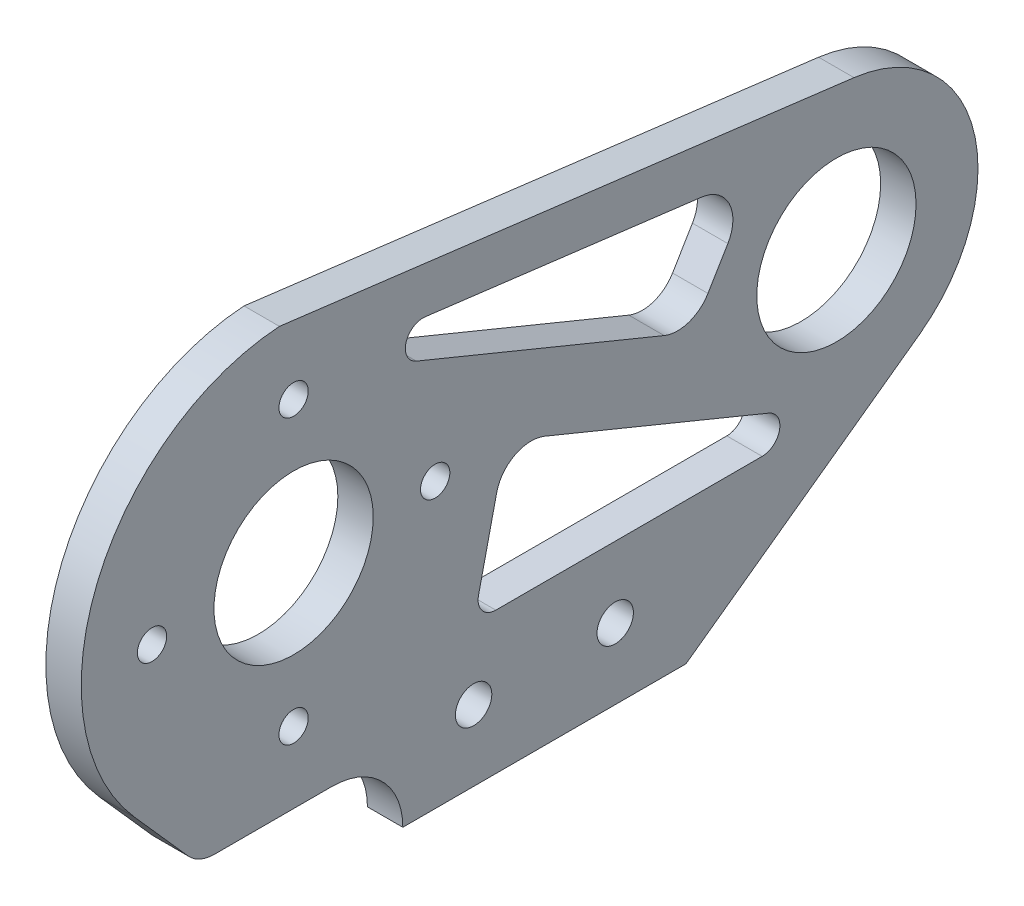
ISO-10303-21;
HEADER;
FILE_DESCRIPTION(('STEP AP214'),'2;1');
FILE_NAME('part.step','',(''),(''),'','','');
FILE_SCHEMA(('AUTOMOTIVE_DESIGN { 1 0 10303 214 1 1 1 1 }'));
ENDSEC;
DATA;
#1=APPLICATION_CONTEXT('core data for automotive mechanical design processes');
#2=APPLICATION_PROTOCOL_DEFINITION('international standard','automotive_design',2000,#1);
#3=PRODUCT_CONTEXT('',#1,'mechanical');
#4=PRODUCT('Part','Part','',(#3));
#5=PRODUCT_RELATED_PRODUCT_CATEGORY('part','',(#4));
#6=PRODUCT_DEFINITION_FORMATION('','',#4);
#7=PRODUCT_DEFINITION_CONTEXT('part definition',#1,'design');
#8=PRODUCT_DEFINITION('design','',#6,#7);
#9=PRODUCT_DEFINITION_SHAPE('','',#8);
#10=(LENGTH_UNIT() NAMED_UNIT(*) SI_UNIT(.MILLI.,.METRE.));
#11=(NAMED_UNIT(*) PLANE_ANGLE_UNIT() SI_UNIT($,.RADIAN.));
#12=(NAMED_UNIT(*) SI_UNIT($,.STERADIAN.) SOLID_ANGLE_UNIT());
#13=UNCERTAINTY_MEASURE_WITH_UNIT(LENGTH_MEASURE(1.E-05),#10,'distance_accuracy_value','');
#14=(GEOMETRIC_REPRESENTATION_CONTEXT(3) GLOBAL_UNCERTAINTY_ASSIGNED_CONTEXT((#13)) GLOBAL_UNIT_ASSIGNED_CONTEXT((#10,
#11,#12)) REPRESENTATION_CONTEXT('',''));
#15=CARTESIAN_POINT('',(0.,0.,0.));
#16=DIRECTION('',(0.,0.,1.));
#17=DIRECTION('',(1.,0.,0.));
#18=AXIS2_PLACEMENT_3D('',#15,#16,#17);
#19=CARTESIAN_POINT('',(6.35,50.8851232861347,-5.80393720326229));
#20=DIRECTION('',(1.,0.,0.));
#21=DIRECTION('',(0.,0.,-1.));
#22=AXIS2_PLACEMENT_3D('',#19,#20,#21);
#23=PLANE('',#22);
#24=DIRECTION('',(0.,0.379904230506979,0.925025824311354));
#25=VECTOR('',#24,1.);
#26=CARTESIAN_POINT('',(6.35,50.8851232861347,-77.3334148983434));
#27=LINE('',#26,#25);
#28=CARTESIAN_POINT('',(6.35,52.9606160409903,-72.2798139056655));
#29=VERTEX_POINT('',#28);
#30=CARTESIAN_POINT('',(6.35,71.2199879210552,-27.8202128577265));
#31=VERTEX_POINT('',#30);
#32=EDGE_CURVE('E464',#29,#31,#27,.T.);
#33=ORIENTED_EDGE('',*,*,#32,.T.);
#34=CARTESIAN_POINT('',(6.35,74.1569449132437,-29.0264087895862));
#35=DIRECTION('',(1.,0.,0.));
#36=DIRECTION('',(0.,0.,-1.));
#37=AXIS2_PLACEMENT_3D('',#34,#35,#36);
#38=CIRCLE('',#37,3.175);
#39=CARTESIAN_POINT('',(6.35,77.3073858178269,-29.4205497627529));
#40=VERTEX_POINT('',#39);
#41=EDGE_CURVE('E319',#31,#40,#38,.F.);
#42=ORIENTED_EDGE('',*,*,#41,.T.);
#43=DIRECTION('',(0.,-0.124138889186376,-0.992264851837236));
#44=VECTOR('',#43,1.);
#45=CARTESIAN_POINT('',(6.35,80.261980091777,-5.80393720326229));
#46=LINE('',#45,#44);
#47=CARTESIAN_POINT('',(6.35,71.0982703150576,-79.0511459020964));
#48=VERTEX_POINT('',#47);
#49=EDGE_CURVE('E748',#40,#48,#46,.T.);
#50=ORIENTED_EDGE('',*,*,#49,.T.);
#51=CARTESIAN_POINT('',(6.35,64.7973885058911,-78.2628639557629));
#52=DIRECTION('',(1.,0.,0.));
#53=DIRECTION('',(0.,0.,-1.));
#54=AXIS2_PLACEMENT_3D('',#51,#52,#53);
#55=CIRCLE('',#54,6.35);
#56=CARTESIAN_POINT('',(6.35,61.5350824967538,-83.710786449957));
#57=VERTEX_POINT('',#56);
#58=EDGE_CURVE('E310',#48,#57,#55,.F.);
#59=ORIENTED_EDGE('',*,*,#58,.T.);
#60=DIRECTION('',(0.,-0.857940550266799,0.513748977816893));
#61=VECTOR('',#60,1.);
#62=CARTESIAN_POINT('',(6.35,69.8894439562592,-88.7135161365292));
#63=LINE('',#62,#61);
#64=CARTESIAN_POINT('',(6.35,55.5722240162302,-80.140128263579));
#65=VERTEX_POINT('',#64);
#66=EDGE_CURVE('E743',#57,#65,#63,.T.);
#67=ORIENTED_EDGE('',*,*,#66,.T.);
#68=CARTESIAN_POINT('',(6.35,58.8345300253674,-74.6922057693848));
#69=DIRECTION('',(1.,0.,0.));
#70=DIRECTION('',(0.,0.,-1.));
#71=AXIS2_PLACEMENT_3D('',#68,#69,#70);
#72=CIRCLE('',#71,6.35);
#73=EDGE_CURVE('E299',#65,#29,#72,.F.);
#74=ORIENTED_EDGE('',*,*,#73,.T.);
#75=EDGE_LOOP('',(#33,#42,#50,#59,#67,#74));
#76=FACE_BOUND('',#75,.T.);
#77=DIRECTION('',(0.,-0.379904230506979,-0.925025824311354));
#78=VECTOR('',#77,1.);
#79=CARTESIAN_POINT('',(6.35,25.4,-105.957463545871));
#80=LINE('',#79,#78);
#81=CARTESIAN_POINT('',(6.35,48.0355854751354,-50.8422544181257));
#82=VERTEX_POINT('',#81);
#83=CARTESIAN_POINT('',(6.35,31.5119569921885,-91.0755075136625));
#84=VERTEX_POINT('',#83);
#85=EDGE_CURVE('E444',#82,#84,#80,.T.);
#86=ORIENTED_EDGE('',*,*,#85,.T.);
#87=CARTESIAN_POINT('',(6.35,28.575,-89.8693115818029));
#88=DIRECTION('',(1.,0.,0.));
#89=DIRECTION('',(0.,0.,-1.));
#90=AXIS2_PLACEMENT_3D('',#87,#88,#89);
#91=CIRCLE('',#90,3.175);
#92=CARTESIAN_POINT('',(6.35,25.4,-89.8693115818029));
#93=VERTEX_POINT('',#92);
#94=EDGE_CURVE('E350',#84,#93,#91,.F.);
#95=ORIENTED_EDGE('',*,*,#94,.T.);
#96=DIRECTION('',(0.,0.,1.));
#97=VECTOR('',#96,1.);
#98=CARTESIAN_POINT('',(6.35,25.4,-38.1));
#99=LINE('',#98,#97);
#100=CARTESIAN_POINT('',(6.35,25.4,-42.0793633905013));
#101=VERTEX_POINT('',#100);
#102=EDGE_CURVE('E442',#93,#101,#99,.T.);
#103=ORIENTED_EDGE('',*,*,#102,.T.);
#104=CARTESIAN_POINT('',(6.35,28.575,-42.0793633905013));
#105=DIRECTION('',(1.,0.,0.));
#106=DIRECTION('',(0.,0.,-1.));
#107=AXIS2_PLACEMENT_3D('',#104,#105,#106);
#108=CIRCLE('',#107,3.175);
#109=CARTESIAN_POINT('',(6.35,29.280017267135,-38.9836283157507));
#110=VERTEX_POINT('',#109);
#111=EDGE_CURVE('E341',#101,#110,#108,.F.);
#112=ORIENTED_EDGE('',*,*,#111,.T.);
#113=DIRECTION('',(0.,0.975034669212807,-0.222052682562207));
#114=VECTOR('',#113,1.);
#115=CARTESIAN_POINT('',(6.35,50.8851232861347,-43.9039372032623));
#116=LINE('',#115,#114);
#117=CARTESIAN_POINT('',(6.35,43.5717060250283,-42.238392404905));
#118=VERTEX_POINT('',#117);
#119=EDGE_CURVE('E450',#110,#118,#116,.T.);
#120=ORIENTED_EDGE('',*,*,#119,.T.);
#121=CARTESIAN_POINT('',(6.35,42.1616714907583,-48.4298625544063));
#122=DIRECTION('',(1.,0.,0.));
#123=DIRECTION('',(0.,0.,-1.));
#124=AXIS2_PLACEMENT_3D('',#121,#122,#123);
#125=CIRCLE('',#124,6.35);
#126=EDGE_CURVE('E330',#118,#82,#125,.F.);
#127=ORIENTED_EDGE('',*,*,#126,.T.);
#128=EDGE_LOOP('',(#86,#95,#103,#112,#120,#127));
#129=FACE_BOUND('',#128,.T.);
#130=DIRECTION('',(0.,-0.748266379436419,-0.66339839116862));
#131=VECTOR('',#130,1.);
#132=CARTESIAN_POINT('',(6.35,0.,0.));
#133=LINE('',#132,#131);
#134=CARTESIAN_POINT('',(6.35,25.6096445826102,22.7050118532653));
#135=VERTEX_POINT('',#134);
#136=CARTESIAN_POINT('',(6.35,14.8374202160793,13.1545676392054));
#137=VERTEX_POINT('',#136);
#138=EDGE_CURVE('E199',#135,#137,#133,.T.);
#139=ORIENTED_EDGE('',*,*,#138,.T.);
#140=CARTESIAN_POINT('',(6.35,19.05,8.40307612978418));
#141=DIRECTION('',(1.,0.,0.));
#142=DIRECTION('',(0.,0.,-1.));
#143=AXIS2_PLACEMENT_3D('',#140,#141,#142);
#144=CIRCLE('',#143,6.35);
#145=CARTESIAN_POINT('',(6.35,12.7,8.40307612978418));
#146=VERTEX_POINT('',#145);
#147=EDGE_CURVE('E60',#137,#146,#144,.T.);
#148=ORIENTED_EDGE('',*,*,#147,.T.);
#149=DIRECTION('',(0.,0.,-1.));
#150=VECTOR('',#149,1.);
#151=CARTESIAN_POINT('',(6.35,12.7,0.));
#152=LINE('',#151,#150);
#153=CARTESIAN_POINT('',(6.35,12.7,-12.7));
#154=VERTEX_POINT('',#153);
#155=EDGE_CURVE('E182',#146,#154,#152,.T.);
#156=ORIENTED_EDGE('',*,*,#155,.T.);
#157=CARTESIAN_POINT('',(6.35,0.,-12.7));
#158=DIRECTION('',(1.,0.,0.));
#159=DIRECTION('',(0.,0.,-1.));
#160=AXIS2_PLACEMENT_3D('',#157,#158,#159);
#161=CIRCLE('',#160,12.7);
#162=CARTESIAN_POINT('',(6.35,0.,-25.4));
#163=VERTEX_POINT('',#162);
#164=EDGE_CURVE('E177',#154,#163,#161,.F.);
#165=ORIENTED_EDGE('',*,*,#164,.T.);
#166=DIRECTION('',(0.,0.,-1.));
#167=VECTOR('',#166,1.);
#168=CARTESIAN_POINT('',(6.35,0.,0.));
#169=LINE('',#168,#167);
#170=CARTESIAN_POINT('',(6.35,0.,-76.2));
#171=VERTEX_POINT('',#170);
#172=EDGE_CURVE('E180',#163,#171,#169,.T.);
#173=ORIENTED_EDGE('',*,*,#172,.T.);
#174=DIRECTION('',(0.,0.585201192116197,-0.81088813331173));
#175=VECTOR('',#174,1.);
#176=CARTESIAN_POINT('',(6.35,0.,-76.2));
#177=LINE('',#176,#175);
#178=CARTESIAN_POINT('',(6.35,30.2034414138821,-118.051610279751));
#179=VERTEX_POINT('',#178);
#180=EDGE_CURVE('E198',#171,#179,#177,.T.);
#181=ORIENTED_EDGE('',*,*,#180,.T.);
#182=CARTESIAN_POINT('',(6.35,50.8,-103.1875));
#183=DIRECTION('',(1.,0.,0.));
#184=DIRECTION('',(0.,0.,-1.));
#185=AXIS2_PLACEMENT_3D('',#182,#183,#184);
#186=CIRCLE('',#185,25.4);
#187=CARTESIAN_POINT('',(6.35,76.0035272366658,-106.340627785334));
#188=VERTEX_POINT('',#187);
#189=EDGE_CURVE('E260',#179,#188,#186,.T.);
#190=ORIENTED_EDGE('',*,*,#189,.T.);
#191=DIRECTION('',(0.,0.124138889186376,0.992264851837236));
#192=VECTOR('',#191,1.);
#193=CARTESIAN_POINT('',(6.35,76.0035272366658,-106.340627785334));
#194=LINE('',#193,#192);
#195=CARTESIAN_POINT('',(6.35,88.8999232951525,-3.25737476059984));
#196=VERTEX_POINT('',#195);
#197=EDGE_CURVE('E262',#188,#196,#194,.T.);
#198=ORIENTED_EDGE('',*,*,#197,.T.);
#199=CARTESIAN_POINT('',(6.35,50.8851232861347,-5.80393720326229));
#200=DIRECTION('',(1.,0.,0.));
#201=DIRECTION('',(0.,0.,-1.));
#202=AXIS2_PLACEMENT_3D('',#199,#200,#201);
#203=CIRCLE('',#202,38.1);
#204=EDGE_CURVE('E264',#196,#135,#203,.T.);
#205=ORIENTED_EDGE('',*,*,#204,.T.);
#206=EDGE_LOOP('',(#139,#148,#156,#165,#173,#181,#190,#198,#205));
#207=FACE_BOUND('',#206,.T.);
#208=CARTESIAN_POINT('',(6.35,50.8851232861347,-31.2039372032623));
#209=DIRECTION('',(1.,0.,0.));
#210=DIRECTION('',(0.,0.,-1.));
#211=AXIS2_PLACEMENT_3D('',#208,#209,#210);
#212=CIRCLE('',#211,2.62890000000002);
#213=CARTESIAN_POINT('',(6.35,50.8851232861347,-33.8328372032623));
#214=VERTEX_POINT('',#213);
#215=EDGE_CURVE('E215',#214,#214,#212,.T.);
#216=ORIENTED_EDGE('',*,*,#215,.F.);
#217=EDGE_LOOP('',(#216));
#218=FACE_BOUND('',#217,.T.);
#219=CARTESIAN_POINT('',(6.35,76.2851232861346,-5.80393720326229));
#220=DIRECTION('',(1.,0.,0.));
#221=DIRECTION('',(0.,0.,-1.));
#222=AXIS2_PLACEMENT_3D('',#219,#220,#221);
#223=CIRCLE('',#222,2.62890000000003);
#224=CARTESIAN_POINT('',(6.35,76.2851232861346,-8.43283720326233));
#225=VERTEX_POINT('',#224);
#226=EDGE_CURVE('E227',#225,#225,#223,.T.);
#227=ORIENTED_EDGE('',*,*,#226,.F.);
#228=EDGE_LOOP('',(#227));
#229=FACE_BOUND('',#228,.T.);
#230=CARTESIAN_POINT('',(6.35,12.7,-63.5));
#231=DIRECTION('',(1.,0.,0.));
#232=DIRECTION('',(0.,0.,-1.));
#233=AXIS2_PLACEMENT_3D('',#230,#231,#232);
#234=CIRCLE('',#233,3.26390000000002);
#235=CARTESIAN_POINT('',(6.35,12.7,-66.7639));
#236=VERTEX_POINT('',#235);
#237=EDGE_CURVE('E239',#236,#236,#234,.T.);
#238=ORIENTED_EDGE('',*,*,#237,.F.);
#239=EDGE_LOOP('',(#238));
#240=FACE_BOUND('',#239,.T.);
#241=CARTESIAN_POINT('',(6.35,50.8851232861347,-5.80393720326229));
#242=DIRECTION('',(1.,0.,0.));
#243=DIRECTION('',(0.,0.,-1.));
#244=AXIS2_PLACEMENT_3D('',#241,#242,#243);
#245=CIRCLE('',#244,14.2875);
#246=CARTESIAN_POINT('',(6.35,50.8851232861347,-20.0914372032623));
#247=VERTEX_POINT('',#246);
#248=EDGE_CURVE('E251',#247,#247,#245,.T.);
#249=ORIENTED_EDGE('',*,*,#248,.F.);
#250=EDGE_LOOP('',(#249));
#251=FACE_BOUND('',#250,.T.);
#252=CARTESIAN_POINT('',(6.35,12.7,-38.1));
#253=DIRECTION('',(1.,0.,0.));
#254=DIRECTION('',(0.,0.,-1.));
#255=AXIS2_PLACEMENT_3D('',#252,#253,#254);
#256=CIRCLE('',#255,3.26390000000003);
#257=CARTESIAN_POINT('',(6.35,12.7,-41.3639));
#258=VERTEX_POINT('',#257);
#259=EDGE_CURVE('E245',#258,#258,#256,.T.);
#260=ORIENTED_EDGE('',*,*,#259,.F.);
#261=EDGE_LOOP('',(#260));
#262=FACE_BOUND('',#261,.T.);
#263=CARTESIAN_POINT('',(6.35,50.8,-103.1875));
#264=DIRECTION('',(1.,0.,0.));
#265=DIRECTION('',(0.,0.,-1.));
#266=AXIS2_PLACEMENT_3D('',#263,#264,#265);
#267=CIRCLE('',#266,14.2875);
#268=CARTESIAN_POINT('',(6.35,50.8,-117.475));
#269=VERTEX_POINT('',#268);
#270=EDGE_CURVE('E233',#269,#269,#267,.T.);
#271=ORIENTED_EDGE('',*,*,#270,.F.);
#272=EDGE_LOOP('',(#271));
#273=FACE_BOUND('',#272,.T.);
#274=CARTESIAN_POINT('',(6.35,25.4851232861347,-5.8039372032623));
#275=DIRECTION('',(1.,0.,0.));
#276=DIRECTION('',(0.,0.,-1.));
#277=AXIS2_PLACEMENT_3D('',#274,#275,#276);
#278=CIRCLE('',#277,2.62890000000002);
#279=CARTESIAN_POINT('',(6.35,25.4851232861347,-8.43283720326232));
#280=VERTEX_POINT('',#279);
#281=EDGE_CURVE('E221',#280,#280,#278,.T.);
#282=ORIENTED_EDGE('',*,*,#281,.F.);
#283=EDGE_LOOP('',(#282));
#284=FACE_BOUND('',#283,.T.);
#285=CARTESIAN_POINT('',(6.35,50.8851232861347,19.5960627967377));
#286=DIRECTION('',(1.,0.,0.));
#287=DIRECTION('',(0.,0.,-1.));
#288=AXIS2_PLACEMENT_3D('',#285,#286,#287);
#289=CIRCLE('',#288,2.62890000000003);
#290=CARTESIAN_POINT('',(6.35,50.8851232861347,16.9671627967377));
#291=VERTEX_POINT('',#290);
#292=EDGE_CURVE('E206',#291,#291,#289,.T.);
#293=ORIENTED_EDGE('',*,*,#292,.F.);
#294=EDGE_LOOP('',(#293));
#295=FACE_BOUND('',#294,.T.);
#296=ADVANCED_FACE('F38',(#76,#129,#207,#218,#229,#240,#251,#262,#273,#284,#295),#23,.T.);
#297=CARTESIAN_POINT('',(0.,50.8851232861347,-5.80393720326229));
#298=DIRECTION('',(1.,0.,0.));
#299=DIRECTION('',(0.,0.,-1.));
#300=AXIS2_PLACEMENT_3D('',#297,#298,#299);
#301=PLANE('',#300);
#302=DIRECTION('',(0.,-0.857940550266799,0.513748977816893));
#303=VECTOR('',#302,1.);
#304=CARTESIAN_POINT('',(0.,69.8894439562592,-88.7135161365292));
#305=LINE('',#304,#303);
#306=CARTESIAN_POINT('',(0.,61.5350824967538,-83.710786449957));
#307=VERTEX_POINT('',#306);
#308=CARTESIAN_POINT('',(0.,55.5722240162302,-80.140128263579));
#309=VERTEX_POINT('',#308);
#310=EDGE_CURVE('E754',#307,#309,#305,.T.);
#311=ORIENTED_EDGE('',*,*,#310,.F.);
#312=CARTESIAN_POINT('',(0.,64.7973885058911,-78.2628639557629));
#313=DIRECTION('',(1.,0.,0.));
#314=DIRECTION('',(0.,0.,-1.));
#315=AXIS2_PLACEMENT_3D('',#312,#313,#314);
#316=CIRCLE('',#315,6.35);
#317=CARTESIAN_POINT('',(0.,71.0982703150576,-79.0511459020964));
#318=VERTEX_POINT('',#317);
#319=EDGE_CURVE('E307',#307,#318,#316,.T.);
#320=ORIENTED_EDGE('',*,*,#319,.T.);
#321=DIRECTION('',(0.,-0.124138889186376,-0.992264851837236));
#322=VECTOR('',#321,1.);
#323=CARTESIAN_POINT('',(0.,80.261980091777,-5.80393720326229));
#324=LINE('',#323,#322);
#325=CARTESIAN_POINT('',(0.,77.3073858178269,-29.4205497627529));
#326=VERTEX_POINT('',#325);
#327=EDGE_CURVE('E753',#326,#318,#324,.T.);
#328=ORIENTED_EDGE('',*,*,#327,.F.);
#329=CARTESIAN_POINT('',(0.,74.1569449132437,-29.0264087895862));
#330=DIRECTION('',(1.,0.,0.));
#331=DIRECTION('',(0.,0.,-1.));
#332=AXIS2_PLACEMENT_3D('',#329,#330,#331);
#333=CIRCLE('',#332,3.175);
#334=CARTESIAN_POINT('',(0.,71.2199879210552,-27.8202128577265));
#335=VERTEX_POINT('',#334);
#336=EDGE_CURVE('E317',#326,#335,#333,.T.);
#337=ORIENTED_EDGE('',*,*,#336,.T.);
#338=DIRECTION('',(0.,0.379904230506979,0.925025824311354));
#339=VECTOR('',#338,1.);
#340=CARTESIAN_POINT('',(0.,50.8851232861347,-77.3334148983434));
#341=LINE('',#340,#339);
#342=CARTESIAN_POINT('',(0.,52.9606160409903,-72.2798139056655));
#343=VERTEX_POINT('',#342);
#344=EDGE_CURVE('E458',#343,#335,#341,.T.);
#345=ORIENTED_EDGE('',*,*,#344,.F.);
#346=CARTESIAN_POINT('',(0.,58.8345300253674,-74.6922057693848));
#347=DIRECTION('',(1.,0.,0.));
#348=DIRECTION('',(0.,0.,-1.));
#349=AXIS2_PLACEMENT_3D('',#346,#347,#348);
#350=CIRCLE('',#349,6.35);
#351=EDGE_CURVE('E296',#343,#309,#350,.T.);
#352=ORIENTED_EDGE('',*,*,#351,.T.);
#353=EDGE_LOOP('',(#311,#320,#328,#337,#345,#352));
#354=FACE_BOUND('',#353,.T.);
#355=DIRECTION('',(0.,0.975034669212807,-0.222052682562207));
#356=VECTOR('',#355,1.);
#357=CARTESIAN_POINT('',(0.,50.8851232861347,-43.9039372032623));
#358=LINE('',#357,#356);
#359=CARTESIAN_POINT('',(0.,29.280017267135,-38.9836283157507));
#360=VERTEX_POINT('',#359);
#361=CARTESIAN_POINT('',(0.,43.5717060250283,-42.238392404905));
#362=VERTEX_POINT('',#361);
#363=EDGE_CURVE('E455',#360,#362,#358,.T.);
#364=ORIENTED_EDGE('',*,*,#363,.F.);
#365=CARTESIAN_POINT('',(0.,28.575,-42.0793633905013));
#366=DIRECTION('',(1.,0.,0.));
#367=DIRECTION('',(0.,0.,-1.));
#368=AXIS2_PLACEMENT_3D('',#365,#366,#367);
#369=CIRCLE('',#368,3.175);
#370=CARTESIAN_POINT('',(0.,25.4,-42.0793633905013));
#371=VERTEX_POINT('',#370);
#372=EDGE_CURVE('E338',#360,#371,#369,.T.);
#373=ORIENTED_EDGE('',*,*,#372,.T.);
#374=DIRECTION('',(0.,0.,1.));
#375=VECTOR('',#374,1.);
#376=CARTESIAN_POINT('',(0.,25.4,-38.1));
#377=LINE('',#376,#375);
#378=CARTESIAN_POINT('',(0.,25.4,-89.8693115818029));
#379=VERTEX_POINT('',#378);
#380=EDGE_CURVE('E462',#379,#371,#377,.T.);
#381=ORIENTED_EDGE('',*,*,#380,.F.);
#382=CARTESIAN_POINT('',(0.,28.575,-89.8693115818029));
#383=DIRECTION('',(1.,0.,0.));
#384=DIRECTION('',(0.,0.,-1.));
#385=AXIS2_PLACEMENT_3D('',#382,#383,#384);
#386=CIRCLE('',#385,3.175);
#387=CARTESIAN_POINT('',(0.,31.5119569921885,-91.0755075136625));
#388=VERTEX_POINT('',#387);
#389=EDGE_CURVE('E348',#379,#388,#386,.T.);
#390=ORIENTED_EDGE('',*,*,#389,.T.);
#391=DIRECTION('',(0.,-0.379904230506979,-0.925025824311354));
#392=VECTOR('',#391,1.);
#393=CARTESIAN_POINT('',(0.,25.4,-105.957463545871));
#394=LINE('',#393,#392);
#395=CARTESIAN_POINT('',(0.,48.0355854751354,-50.8422544181257));
#396=VERTEX_POINT('',#395);
#397=EDGE_CURVE('E451',#396,#388,#394,.T.);
#398=ORIENTED_EDGE('',*,*,#397,.F.);
#399=CARTESIAN_POINT('',(0.,42.1616714907583,-48.4298625544063));
#400=DIRECTION('',(1.,0.,0.));
#401=DIRECTION('',(0.,0.,-1.));
#402=AXIS2_PLACEMENT_3D('',#399,#400,#401);
#403=CIRCLE('',#402,6.35);
#404=EDGE_CURVE('E327',#396,#362,#403,.T.);
#405=ORIENTED_EDGE('',*,*,#404,.T.);
#406=EDGE_LOOP('',(#364,#373,#381,#390,#398,#405));
#407=FACE_BOUND('',#406,.T.);
#408=DIRECTION('',(0.,0.,-1.));
#409=VECTOR('',#408,1.);
#410=CARTESIAN_POINT('',(0.,12.7,0.));
#411=LINE('',#410,#409);
#412=CARTESIAN_POINT('',(0.,12.7,8.40307612978418));
#413=VERTEX_POINT('',#412);
#414=CARTESIAN_POINT('',(0.,12.7,-12.7));
#415=VERTEX_POINT('',#414);
#416=EDGE_CURVE('E208',#413,#415,#411,.T.);
#417=ORIENTED_EDGE('',*,*,#416,.F.);
#418=CARTESIAN_POINT('',(0.,19.05,8.40307612978418));
#419=DIRECTION('',(1.,0.,0.));
#420=DIRECTION('',(0.,0.,-1.));
#421=AXIS2_PLACEMENT_3D('',#418,#419,#420);
#422=CIRCLE('',#421,6.35);
#423=CARTESIAN_POINT('',(0.,14.8374202160793,13.1545676392054));
#424=VERTEX_POINT('',#423);
#425=EDGE_CURVE('E11',#413,#424,#422,.F.);
#426=ORIENTED_EDGE('',*,*,#425,.T.);
#427=DIRECTION('',(0.,-0.748266379436419,-0.66339839116862));
#428=VECTOR('',#427,1.);
#429=CARTESIAN_POINT('',(0.,0.,0.));
#430=LINE('',#429,#428);
#431=CARTESIAN_POINT('',(0.,25.6096445826102,22.7050118532653));
#432=VERTEX_POINT('',#431);
#433=EDGE_CURVE('E254',#432,#424,#430,.T.);
#434=ORIENTED_EDGE('',*,*,#433,.F.);
#435=CARTESIAN_POINT('',(0.,50.8851232861347,-5.80393720326229));
#436=DIRECTION('',(1.,0.,0.));
#437=DIRECTION('',(0.,0.,-1.));
#438=AXIS2_PLACEMENT_3D('',#435,#436,#437);
#439=CIRCLE('',#438,38.1);
#440=CARTESIAN_POINT('',(0.,88.8999232951525,-3.25737476059984));
#441=VERTEX_POINT('',#440);
#442=EDGE_CURVE('E257',#441,#432,#439,.T.);
#443=ORIENTED_EDGE('',*,*,#442,.F.);
#444=DIRECTION('',(0.,0.124138889186376,0.992264851837236));
#445=VECTOR('',#444,1.);
#446=CARTESIAN_POINT('',(0.,76.0035272366658,-106.340627785334));
#447=LINE('',#446,#445);
#448=CARTESIAN_POINT('',(0.,76.0035272366658,-106.340627785334));
#449=VERTEX_POINT('',#448);
#450=EDGE_CURVE('E275',#449,#441,#447,.T.);
#451=ORIENTED_EDGE('',*,*,#450,.F.);
#452=CARTESIAN_POINT('',(0.,50.8,-103.1875));
#453=DIRECTION('',(1.,0.,0.));
#454=DIRECTION('',(0.,0.,-1.));
#455=AXIS2_PLACEMENT_3D('',#452,#453,#454);
#456=CIRCLE('',#455,25.4);
#457=CARTESIAN_POINT('',(0.,30.2034414138821,-118.051610279751));
#458=VERTEX_POINT('',#457);
#459=EDGE_CURVE('E273',#458,#449,#456,.T.);
#460=ORIENTED_EDGE('',*,*,#459,.F.);
#461=DIRECTION('',(0.,0.585201192116197,-0.81088813331173));
#462=VECTOR('',#461,1.);
#463=CARTESIAN_POINT('',(0.,0.,-76.2));
#464=LINE('',#463,#462);
#465=CARTESIAN_POINT('',(0.,0.,-76.2));
#466=VERTEX_POINT('',#465);
#467=EDGE_CURVE('E271',#466,#458,#464,.T.);
#468=ORIENTED_EDGE('',*,*,#467,.F.);
#469=DIRECTION('',(0.,0.,-1.));
#470=VECTOR('',#469,1.);
#471=CARTESIAN_POINT('',(0.,0.,0.));
#472=LINE('',#471,#470);
#473=CARTESIAN_POINT('',(0.,0.,-25.4));
#474=VERTEX_POINT('',#473);
#475=EDGE_CURVE('E269',#474,#466,#472,.T.);
#476=ORIENTED_EDGE('',*,*,#475,.F.);
#477=CARTESIAN_POINT('',(0.,0.,-12.7));
#478=DIRECTION('',(1.,0.,0.));
#479=DIRECTION('',(0.,0.,-1.));
#480=AXIS2_PLACEMENT_3D('',#477,#478,#479);
#481=CIRCLE('',#480,12.7);
#482=EDGE_CURVE('E188',#474,#415,#481,.T.);
#483=ORIENTED_EDGE('',*,*,#482,.T.);
#484=EDGE_LOOP('',(#417,#426,#434,#443,#451,#460,#468,#476,#483));
#485=FACE_BOUND('',#484,.T.);
#486=CARTESIAN_POINT('',(0.,50.8851232861347,-5.80393720326229));
#487=DIRECTION('',(1.,0.,0.));
#488=DIRECTION('',(0.,0.,-1.));
#489=AXIS2_PLACEMENT_3D('',#486,#487,#488);
#490=CIRCLE('',#489,14.2875);
#491=CARTESIAN_POINT('',(0.,50.8851232861347,-20.0914372032623));
#492=VERTEX_POINT('',#491);
#493=EDGE_CURVE('E248',#492,#492,#490,.T.);
#494=ORIENTED_EDGE('',*,*,#493,.T.);
#495=EDGE_LOOP('',(#494));
#496=FACE_BOUND('',#495,.T.);
#497=CARTESIAN_POINT('',(0.,12.7,-38.1));
#498=DIRECTION('',(1.,0.,0.));
#499=DIRECTION('',(0.,0.,-1.));
#500=AXIS2_PLACEMENT_3D('',#497,#498,#499);
#501=CIRCLE('',#500,3.26390000000003);
#502=CARTESIAN_POINT('',(0.,12.7,-41.3639));
#503=VERTEX_POINT('',#502);
#504=EDGE_CURVE('E242',#503,#503,#501,.T.);
#505=ORIENTED_EDGE('',*,*,#504,.T.);
#506=EDGE_LOOP('',(#505));
#507=FACE_BOUND('',#506,.T.);
#508=CARTESIAN_POINT('',(0.,12.7,-63.5));
#509=DIRECTION('',(1.,0.,0.));
#510=DIRECTION('',(0.,0.,-1.));
#511=AXIS2_PLACEMENT_3D('',#508,#509,#510);
#512=CIRCLE('',#511,3.26390000000002);
#513=CARTESIAN_POINT('',(0.,12.7,-66.7639));
#514=VERTEX_POINT('',#513);
#515=EDGE_CURVE('E236',#514,#514,#512,.T.);
#516=ORIENTED_EDGE('',*,*,#515,.T.);
#517=EDGE_LOOP('',(#516));
#518=FACE_BOUND('',#517,.T.);
#519=CARTESIAN_POINT('',(0.,50.8,-103.1875));
#520=DIRECTION('',(1.,0.,0.));
#521=DIRECTION('',(0.,0.,-1.));
#522=AXIS2_PLACEMENT_3D('',#519,#520,#521);
#523=CIRCLE('',#522,14.2875);
#524=CARTESIAN_POINT('',(0.,50.8,-117.475));
#525=VERTEX_POINT('',#524);
#526=EDGE_CURVE('E230',#525,#525,#523,.T.);
#527=ORIENTED_EDGE('',*,*,#526,.T.);
#528=EDGE_LOOP('',(#527));
#529=FACE_BOUND('',#528,.T.);
#530=CARTESIAN_POINT('',(0.,76.2851232861346,-5.80393720326229));
#531=DIRECTION('',(1.,0.,0.));
#532=DIRECTION('',(0.,0.,-1.));
#533=AXIS2_PLACEMENT_3D('',#530,#531,#532);
#534=CIRCLE('',#533,2.62890000000003);
#535=CARTESIAN_POINT('',(0.,76.2851232861346,-8.43283720326233));
#536=VERTEX_POINT('',#535);
#537=EDGE_CURVE('E224',#536,#536,#534,.T.);
#538=ORIENTED_EDGE('',*,*,#537,.T.);
#539=EDGE_LOOP('',(#538));
#540=FACE_BOUND('',#539,.T.);
#541=CARTESIAN_POINT('',(0.,25.4851232861347,-5.8039372032623));
#542=DIRECTION('',(1.,0.,0.));
#543=DIRECTION('',(0.,0.,-1.));
#544=AXIS2_PLACEMENT_3D('',#541,#542,#543);
#545=CIRCLE('',#544,2.62890000000002);
#546=CARTESIAN_POINT('',(0.,25.4851232861347,-8.43283720326232));
#547=VERTEX_POINT('',#546);
#548=EDGE_CURVE('E218',#547,#547,#545,.T.);
#549=ORIENTED_EDGE('',*,*,#548,.T.);
#550=EDGE_LOOP('',(#549));
#551=FACE_BOUND('',#550,.T.);
#552=CARTESIAN_POINT('',(0.,50.8851232861347,-31.2039372032623));
#553=DIRECTION('',(1.,0.,0.));
#554=DIRECTION('',(0.,0.,-1.));
#555=AXIS2_PLACEMENT_3D('',#552,#553,#554);
#556=CIRCLE('',#555,2.62890000000002);
#557=CARTESIAN_POINT('',(0.,50.8851232861347,-33.8328372032623));
#558=VERTEX_POINT('',#557);
#559=EDGE_CURVE('E213',#558,#558,#556,.T.);
#560=ORIENTED_EDGE('',*,*,#559,.T.);
#561=EDGE_LOOP('',(#560));
#562=FACE_BOUND('',#561,.T.);
#563=CARTESIAN_POINT('',(0.,50.8851232861347,19.5960627967377));
#564=DIRECTION('',(1.,0.,0.));
#565=DIRECTION('',(0.,0.,-1.));
#566=AXIS2_PLACEMENT_3D('',#563,#564,#565);
#567=CIRCLE('',#566,2.62890000000003);
#568=CARTESIAN_POINT('',(0.,50.8851232861347,16.9671627967377));
#569=VERTEX_POINT('',#568);
#570=EDGE_CURVE('E203',#569,#569,#567,.T.);
#571=ORIENTED_EDGE('',*,*,#570,.T.);
#572=EDGE_LOOP('',(#571));
#573=FACE_BOUND('',#572,.T.);
#574=ADVANCED_FACE('F372',(#354,#407,#485,#496,#507,#518,#529,#540,#551,#562,#573),#301,.F.);
#575=CARTESIAN_POINT('',(6.35,0.,0.));
#576=DIRECTION('',(0.,0.66339839116862,-0.748266379436419));
#577=DIRECTION('',(0.,0.748266379436419,0.66339839116862));
#578=AXIS2_PLACEMENT_3D('',#575,#576,#577);
#579=PLANE('',#578);
#580=ORIENTED_EDGE('',*,*,#433,.T.);
#581=DIRECTION('',(1.,0.,0.));
#582=VECTOR('',#581,1.);
#583=CARTESIAN_POINT('',(6.35,14.8374202160793,13.1545676392054));
#584=LINE('',#583,#582);
#585=EDGE_CURVE('E187',#424,#137,#584,.T.);
#586=ORIENTED_EDGE('',*,*,#585,.T.);
#587=ORIENTED_EDGE('',*,*,#138,.F.);
#588=DIRECTION('',(-1.,0.,0.));
#589=VECTOR('',#588,1.);
#590=CARTESIAN_POINT('',(6.35,25.6096445826102,22.7050118532653));
#591=LINE('',#590,#589);
#592=EDGE_CURVE('E266',#135,#432,#591,.T.);
#593=ORIENTED_EDGE('',*,*,#592,.T.);
#594=EDGE_LOOP('',(#580,#586,#587,#593));
#595=FACE_BOUND('',#594,.T.);
#596=ADVANCED_FACE('F360',(#595),#579,.F.);
#597=CARTESIAN_POINT('',(6.35,0.,0.));
#598=DIRECTION('',(0.,1.,0.));
#599=DIRECTION('',(0.,0.,1.));
#600=AXIS2_PLACEMENT_3D('',#597,#598,#599);
#601=PLANE('',#600);
#602=ORIENTED_EDGE('',*,*,#172,.F.);
#603=DIRECTION('',(-1.,0.,0.));
#604=VECTOR('',#603,1.);
#605=CARTESIAN_POINT('',(6.35,0.,-25.4));
#606=LINE('',#605,#604);
#607=EDGE_CURVE('E193',#163,#474,#606,.T.);
#608=ORIENTED_EDGE('',*,*,#607,.T.);
#609=ORIENTED_EDGE('',*,*,#475,.T.);
#610=DIRECTION('',(-1.,0.,0.));
#611=VECTOR('',#610,1.);
#612=CARTESIAN_POINT('',(6.35,0.,-76.2));
#613=LINE('',#612,#611);
#614=EDGE_CURVE('E196',#171,#466,#613,.T.);
#615=ORIENTED_EDGE('',*,*,#614,.F.);
#616=EDGE_LOOP('',(#602,#608,#609,#615));
#617=FACE_BOUND('',#616,.T.);
#618=ADVANCED_FACE('F192',(#617),#601,.F.);
#619=CARTESIAN_POINT('',(6.35,0.,-76.2));
#620=DIRECTION('',(0.,0.810888133311729,0.585201192116197));
#621=DIRECTION('',(0.,-0.585201192116197,0.81088813331173));
#622=AXIS2_PLACEMENT_3D('',#619,#620,#621);
#623=PLANE('',#622);
#624=ORIENTED_EDGE('',*,*,#467,.T.);
#625=DIRECTION('',(-1.,0.,0.));
#626=VECTOR('',#625,1.);
#627=CARTESIAN_POINT('',(6.35,30.2034414138821,-118.051610279751));
#628=LINE('',#627,#626);
#629=EDGE_CURVE('E286',#179,#458,#628,.T.);
#630=ORIENTED_EDGE('',*,*,#629,.F.);
#631=ORIENTED_EDGE('',*,*,#180,.F.);
#632=ORIENTED_EDGE('',*,*,#614,.T.);
#633=EDGE_LOOP('',(#624,#630,#631,#632));
#634=FACE_BOUND('',#633,.T.);
#635=ADVANCED_FACE('F403',(#634),#623,.F.);
#636=CARTESIAN_POINT('',(6.35,50.8,-103.1875));
#637=DIRECTION('',(-1.,0.,0.));
#638=DIRECTION('',(0.,0.,1.));
#639=AXIS2_PLACEMENT_3D('',#636,#637,#638);
#640=CYLINDRICAL_SURFACE('',#639,25.4);
#641=ORIENTED_EDGE('',*,*,#459,.T.);
#642=DIRECTION('',(-1.,0.,0.));
#643=VECTOR('',#642,1.);
#644=CARTESIAN_POINT('',(6.35,76.0035272366658,-106.340627785334));
#645=LINE('',#644,#643);
#646=EDGE_CURVE('E283',#188,#449,#645,.T.);
#647=ORIENTED_EDGE('',*,*,#646,.F.);
#648=ORIENTED_EDGE('',*,*,#189,.F.);
#649=ORIENTED_EDGE('',*,*,#629,.T.);
#650=EDGE_LOOP('',(#641,#647,#648,#649));
#651=FACE_BOUND('',#650,.T.);
#652=ADVANCED_FACE('F399',(#651),#640,.T.);
#653=CARTESIAN_POINT('',(6.35,76.0035272366658,-106.340627785334));
#654=DIRECTION('',(0.,-0.992264851837236,0.124138889186376));
#655=DIRECTION('',(0.,-0.124138889186376,-0.992264851837236));
#656=AXIS2_PLACEMENT_3D('',#653,#654,#655);
#657=PLANE('',#656);
#658=ORIENTED_EDGE('',*,*,#450,.T.);
#659=DIRECTION('',(-1.,0.,0.));
#660=VECTOR('',#659,1.);
#661=CARTESIAN_POINT('',(6.35,88.8999232951525,-3.25737476059984));
#662=LINE('',#661,#660);
#663=EDGE_CURVE('E280',#196,#441,#662,.T.);
#664=ORIENTED_EDGE('',*,*,#663,.F.);
#665=ORIENTED_EDGE('',*,*,#197,.F.);
#666=ORIENTED_EDGE('',*,*,#646,.T.);
#667=EDGE_LOOP('',(#658,#664,#665,#666));
#668=FACE_BOUND('',#667,.T.);
#669=ADVANCED_FACE('F396',(#668),#657,.F.);
#670=CARTESIAN_POINT('',(6.35,50.8851232861347,-5.80393720326229));
#671=DIRECTION('',(-1.,0.,0.));
#672=DIRECTION('',(0.,0.,1.));
#673=AXIS2_PLACEMENT_3D('',#670,#671,#672);
#674=CYLINDRICAL_SURFACE('',#673,38.1);
#675=ORIENTED_EDGE('',*,*,#442,.T.);
#676=ORIENTED_EDGE('',*,*,#592,.F.);
#677=ORIENTED_EDGE('',*,*,#204,.F.);
#678=ORIENTED_EDGE('',*,*,#663,.T.);
#679=EDGE_LOOP('',(#675,#676,#677,#678));
#680=FACE_BOUND('',#679,.T.);
#681=ADVANCED_FACE('F369',(#680),#674,.T.);
#682=CARTESIAN_POINT('',(6.35,50.8851232861347,-5.80393720326229));
#683=DIRECTION('',(-1.,0.,0.));
#684=DIRECTION('',(0.,0.,1.));
#685=AXIS2_PLACEMENT_3D('',#682,#683,#684);
#686=CYLINDRICAL_SURFACE('',#685,14.2875);
#687=ORIENTED_EDGE('',*,*,#248,.T.);
#688=EDGE_LOOP('',(#687));
#689=FACE_BOUND('',#688,.T.);
#690=ORIENTED_EDGE('',*,*,#493,.F.);
#691=EDGE_LOOP('',(#690));
#692=FACE_BOUND('',#691,.T.);
#693=ADVANCED_FACE('F391',(#689,#692),#686,.F.);
#694=CARTESIAN_POINT('',(6.35,12.7,-38.1));
#695=DIRECTION('',(-1.,0.,0.));
#696=DIRECTION('',(0.,0.,1.));
#697=AXIS2_PLACEMENT_3D('',#694,#695,#696);
#698=CYLINDRICAL_SURFACE('',#697,3.26390000000003);
#699=ORIENTED_EDGE('',*,*,#259,.T.);
#700=EDGE_LOOP('',(#699));
#701=FACE_BOUND('',#700,.T.);
#702=ORIENTED_EDGE('',*,*,#504,.F.);
#703=EDGE_LOOP('',(#702));
#704=FACE_BOUND('',#703,.T.);
#705=ADVANCED_FACE('F514',(#701,#704),#698,.F.);
#706=CARTESIAN_POINT('',(6.35,12.7,-63.5));
#707=DIRECTION('',(-1.,0.,0.));
#708=DIRECTION('',(0.,0.,1.));
#709=AXIS2_PLACEMENT_3D('',#706,#707,#708);
#710=CYLINDRICAL_SURFACE('',#709,3.26390000000002);
#711=ORIENTED_EDGE('',*,*,#237,.T.);
#712=EDGE_LOOP('',(#711));
#713=FACE_BOUND('',#712,.T.);
#714=ORIENTED_EDGE('',*,*,#515,.F.);
#715=EDGE_LOOP('',(#714));
#716=FACE_BOUND('',#715,.T.);
#717=ADVANCED_FACE('F511',(#713,#716),#710,.F.);
#718=CARTESIAN_POINT('',(6.35,50.8,-103.1875));
#719=DIRECTION('',(-1.,0.,0.));
#720=DIRECTION('',(0.,0.,1.));
#721=AXIS2_PLACEMENT_3D('',#718,#719,#720);
#722=CYLINDRICAL_SURFACE('',#721,14.2875);
#723=ORIENTED_EDGE('',*,*,#270,.T.);
#724=EDGE_LOOP('',(#723));
#725=FACE_BOUND('',#724,.T.);
#726=ORIENTED_EDGE('',*,*,#526,.F.);
#727=EDGE_LOOP('',(#726));
#728=FACE_BOUND('',#727,.T.);
#729=ADVANCED_FACE('F507',(#725,#728),#722,.F.);
#730=CARTESIAN_POINT('',(6.35,76.2851232861346,-5.80393720326229));
#731=DIRECTION('',(-1.,0.,0.));
#732=DIRECTION('',(0.,0.,1.));
#733=AXIS2_PLACEMENT_3D('',#730,#731,#732);
#734=CYLINDRICAL_SURFACE('',#733,2.62890000000003);
#735=ORIENTED_EDGE('',*,*,#226,.T.);
#736=EDGE_LOOP('',(#735));
#737=FACE_BOUND('',#736,.T.);
#738=ORIENTED_EDGE('',*,*,#537,.F.);
#739=EDGE_LOOP('',(#738));
#740=FACE_BOUND('',#739,.T.);
#741=ADVANCED_FACE('F503',(#737,#740),#734,.F.);
#742=CARTESIAN_POINT('',(6.35,25.4851232861347,-5.8039372032623));
#743=DIRECTION('',(-1.,0.,0.));
#744=DIRECTION('',(0.,0.,1.));
#745=AXIS2_PLACEMENT_3D('',#742,#743,#744);
#746=CYLINDRICAL_SURFACE('',#745,2.62890000000002);
#747=ORIENTED_EDGE('',*,*,#281,.T.);
#748=EDGE_LOOP('',(#747));
#749=FACE_BOUND('',#748,.T.);
#750=ORIENTED_EDGE('',*,*,#548,.F.);
#751=EDGE_LOOP('',(#750));
#752=FACE_BOUND('',#751,.T.);
#753=ADVANCED_FACE('F499',(#749,#752),#746,.F.);
#754=CARTESIAN_POINT('',(6.35,50.8851232861347,-31.2039372032623));
#755=DIRECTION('',(-1.,0.,0.));
#756=DIRECTION('',(0.,0.,1.));
#757=AXIS2_PLACEMENT_3D('',#754,#755,#756);
#758=CYLINDRICAL_SURFACE('',#757,2.62890000000002);
#759=ORIENTED_EDGE('',*,*,#215,.T.);
#760=EDGE_LOOP('',(#759));
#761=FACE_BOUND('',#760,.T.);
#762=ORIENTED_EDGE('',*,*,#559,.F.);
#763=EDGE_LOOP('',(#762));
#764=FACE_BOUND('',#763,.T.);
#765=ADVANCED_FACE('F495',(#761,#764),#758,.F.);
#766=CARTESIAN_POINT('',(6.35,50.8851232861347,19.5960627967377));
#767=DIRECTION('',(-1.,0.,0.));
#768=DIRECTION('',(0.,0.,1.));
#769=AXIS2_PLACEMENT_3D('',#766,#767,#768);
#770=CYLINDRICAL_SURFACE('',#769,2.62890000000003);
#771=ORIENTED_EDGE('',*,*,#292,.T.);
#772=EDGE_LOOP('',(#771));
#773=FACE_BOUND('',#772,.T.);
#774=ORIENTED_EDGE('',*,*,#570,.F.);
#775=EDGE_LOOP('',(#774));
#776=FACE_BOUND('',#775,.T.);
#777=ADVANCED_FACE('F492',(#773,#776),#770,.F.);
#778=CARTESIAN_POINT('',(6.35,12.7,0.));
#779=DIRECTION('',(0.,1.,0.));
#780=DIRECTION('',(0.,0.,1.));
#781=AXIS2_PLACEMENT_3D('',#778,#779,#780);
#782=PLANE('',#781);
#783=ORIENTED_EDGE('',*,*,#155,.F.);
#784=DIRECTION('',(1.,0.,0.));
#785=VECTOR('',#784,1.);
#786=CARTESIAN_POINT('',(6.35,12.7,8.40307612978418));
#787=LINE('',#786,#785);
#788=EDGE_CURVE('E46',#146,#413,#787,.F.);
#789=ORIENTED_EDGE('',*,*,#788,.T.);
#790=ORIENTED_EDGE('',*,*,#416,.T.);
#791=DIRECTION('',(-1.,0.,0.));
#792=VECTOR('',#791,1.);
#793=CARTESIAN_POINT('',(6.35,12.7,-12.7));
#794=LINE('',#793,#792);
#795=EDGE_CURVE('E352',#415,#154,#794,.F.);
#796=ORIENTED_EDGE('',*,*,#795,.T.);
#797=EDGE_LOOP('',(#783,#789,#790,#796));
#798=FACE_BOUND('',#797,.T.);
#799=ADVANCED_FACE('F485',(#798),#782,.F.);
#800=CARTESIAN_POINT('',(6.35,25.4,-38.1));
#801=DIRECTION('',(0.,-1.,0.));
#802=DIRECTION('',(0.,0.,-1.));
#803=AXIS2_PLACEMENT_3D('',#800,#801,#802);
#804=PLANE('',#803);
#805=ORIENTED_EDGE('',*,*,#102,.F.);
#806=DIRECTION('',(-1.,0.,0.));
#807=VECTOR('',#806,1.);
#808=CARTESIAN_POINT('',(0.,25.4,-89.8693115818029));
#809=LINE('',#808,#807);
#810=EDGE_CURVE('E343',#93,#379,#809,.T.);
#811=ORIENTED_EDGE('',*,*,#810,.T.);
#812=ORIENTED_EDGE('',*,*,#380,.T.);
#813=DIRECTION('',(-1.,0.,0.));
#814=VECTOR('',#813,1.);
#815=CARTESIAN_POINT('',(6.35,25.4,-42.0793633905013));
#816=LINE('',#815,#814);
#817=EDGE_CURVE('E335',#371,#101,#816,.F.);
#818=ORIENTED_EDGE('',*,*,#817,.T.);
#819=EDGE_LOOP('',(#805,#811,#812,#818));
#820=FACE_BOUND('',#819,.T.);
#821=ADVANCED_FACE('F446',(#820),#804,.F.);
#822=CARTESIAN_POINT('',(6.35,25.4,-105.957463545871));
#823=DIRECTION('',(0.,0.925025824311354,-0.379904230506979));
#824=DIRECTION('',(0.,0.379904230506979,0.925025824311354));
#825=AXIS2_PLACEMENT_3D('',#822,#823,#824);
#826=PLANE('',#825);
#827=ORIENTED_EDGE('',*,*,#397,.T.);
#828=DIRECTION('',(-1.,0.,0.));
#829=VECTOR('',#828,1.);
#830=CARTESIAN_POINT('',(6.35,31.5119569921885,-91.0755075136625));
#831=LINE('',#830,#829);
#832=EDGE_CURVE('E346',#388,#84,#831,.F.);
#833=ORIENTED_EDGE('',*,*,#832,.T.);
#834=ORIENTED_EDGE('',*,*,#85,.F.);
#835=DIRECTION('',(-1.,0.,0.));
#836=VECTOR('',#835,1.);
#837=CARTESIAN_POINT('',(0.,48.0355854751354,-50.8422544181256));
#838=LINE('',#837,#836);
#839=EDGE_CURVE('E321',#82,#396,#838,.T.);
#840=ORIENTED_EDGE('',*,*,#839,.T.);
#841=EDGE_LOOP('',(#827,#833,#834,#840));
#842=FACE_BOUND('',#841,.T.);
#843=ADVANCED_FACE('F476',(#842),#826,.F.);
#844=CARTESIAN_POINT('',(6.35,50.8851232861347,-43.9039372032623));
#845=DIRECTION('',(0.,0.222052682562207,0.975034669212807));
#846=DIRECTION('',(0.,-0.975034669212807,0.222052682562207));
#847=AXIS2_PLACEMENT_3D('',#844,#845,#846);
#848=PLANE('',#847);
#849=ORIENTED_EDGE('',*,*,#119,.F.);
#850=DIRECTION('',(-1.,0.,0.));
#851=VECTOR('',#850,1.);
#852=CARTESIAN_POINT('',(0.,29.280017267135,-38.9836283157507));
#853=LINE('',#852,#851);
#854=EDGE_CURVE('E332',#110,#360,#853,.T.);
#855=ORIENTED_EDGE('',*,*,#854,.T.);
#856=ORIENTED_EDGE('',*,*,#363,.T.);
#857=DIRECTION('',(-1.,0.,0.));
#858=VECTOR('',#857,1.);
#859=CARTESIAN_POINT('',(6.35,43.5717060250283,-42.238392404905));
#860=LINE('',#859,#858);
#861=EDGE_CURVE('E324',#362,#118,#860,.F.);
#862=ORIENTED_EDGE('',*,*,#861,.T.);
#863=EDGE_LOOP('',(#849,#855,#856,#862));
#864=FACE_BOUND('',#863,.T.);
#865=ADVANCED_FACE('F468',(#864),#848,.F.);
#866=CARTESIAN_POINT('',(6.35,80.261980091777,-5.80393720326229));
#867=DIRECTION('',(0.,0.992264851837236,-0.124138889186376));
#868=DIRECTION('',(0.,0.124138889186376,0.992264851837236));
#869=AXIS2_PLACEMENT_3D('',#866,#867,#868);
#870=PLANE('',#869);
#871=ORIENTED_EDGE('',*,*,#49,.F.);
#872=DIRECTION('',(-1.,0.,0.));
#873=VECTOR('',#872,1.);
#874=CARTESIAN_POINT('',(0.,77.3073858178269,-29.4205497627529));
#875=LINE('',#874,#873);
#876=EDGE_CURVE('E312',#40,#326,#875,.T.);
#877=ORIENTED_EDGE('',*,*,#876,.T.);
#878=ORIENTED_EDGE('',*,*,#327,.T.);
#879=DIRECTION('',(-1.,0.,0.));
#880=VECTOR('',#879,1.);
#881=CARTESIAN_POINT('',(6.35,71.0982703150576,-79.0511459020964));
#882=LINE('',#881,#880);
#883=EDGE_CURVE('E304',#318,#48,#882,.F.);
#884=ORIENTED_EDGE('',*,*,#883,.T.);
#885=EDGE_LOOP('',(#871,#877,#878,#884));
#886=FACE_BOUND('',#885,.T.);
#887=ADVANCED_FACE('F483',(#886),#870,.F.);
#888=CARTESIAN_POINT('',(6.35,50.8851232861347,-77.3334148983434));
#889=DIRECTION('',(0.,-0.925025824311354,0.379904230506979));
#890=DIRECTION('',(0.,-0.379904230506979,-0.925025824311354));
#891=AXIS2_PLACEMENT_3D('',#888,#889,#890);
#892=PLANE('',#891);
#893=ORIENTED_EDGE('',*,*,#344,.T.);
#894=DIRECTION('',(-1.,0.,0.));
#895=VECTOR('',#894,1.);
#896=CARTESIAN_POINT('',(6.35,71.2199879210552,-27.8202128577265));
#897=LINE('',#896,#895);
#898=EDGE_CURVE('E315',#335,#31,#897,.F.);
#899=ORIENTED_EDGE('',*,*,#898,.T.);
#900=ORIENTED_EDGE('',*,*,#32,.F.);
#901=DIRECTION('',(-1.,0.,0.));
#902=VECTOR('',#901,1.);
#903=CARTESIAN_POINT('',(0.,52.9606160409903,-72.2798139056655));
#904=LINE('',#903,#902);
#905=EDGE_CURVE('E290',#29,#343,#904,.T.);
#906=ORIENTED_EDGE('',*,*,#905,.T.);
#907=EDGE_LOOP('',(#893,#899,#900,#906));
#908=FACE_BOUND('',#907,.T.);
#909=ADVANCED_FACE('F641',(#908),#892,.F.);
#910=CARTESIAN_POINT('',(6.35,69.8894439562592,-88.7135161365292));
#911=DIRECTION('',(0.,-0.513748977816893,-0.857940550266799));
#912=DIRECTION('',(0.,0.857940550266799,-0.513748977816893));
#913=AXIS2_PLACEMENT_3D('',#910,#911,#912);
#914=PLANE('',#913);
#915=ORIENTED_EDGE('',*,*,#66,.F.);
#916=DIRECTION('',(-1.,0.,0.));
#917=VECTOR('',#916,1.);
#918=CARTESIAN_POINT('',(0.,61.5350824967538,-83.710786449957));
#919=LINE('',#918,#917);
#920=EDGE_CURVE('E301',#57,#307,#919,.T.);
#921=ORIENTED_EDGE('',*,*,#920,.T.);
#922=ORIENTED_EDGE('',*,*,#310,.T.);
#923=DIRECTION('',(-1.,0.,0.));
#924=VECTOR('',#923,1.);
#925=CARTESIAN_POINT('',(6.35,55.5722240162302,-80.140128263579));
#926=LINE('',#925,#924);
#927=EDGE_CURVE('E293',#309,#65,#926,.F.);
#928=ORIENTED_EDGE('',*,*,#927,.T.);
#929=EDGE_LOOP('',(#915,#921,#922,#928));
#930=FACE_BOUND('',#929,.T.);
#931=ADVANCED_FACE('F416',(#930),#914,.F.);
#932=CARTESIAN_POINT('',(6.35,58.8345300253674,-74.6922057693848));
#933=DIRECTION('',(1.,0.,0.));
#934=DIRECTION('',(0.,0.,-1.));
#935=AXIS2_PLACEMENT_3D('',#932,#933,#934);
#936=CYLINDRICAL_SURFACE('',#935,6.35);
#937=ORIENTED_EDGE('',*,*,#73,.F.);
#938=ORIENTED_EDGE('',*,*,#927,.F.);
#939=ORIENTED_EDGE('',*,*,#351,.F.);
#940=ORIENTED_EDGE('',*,*,#905,.F.);
#941=EDGE_LOOP('',(#937,#938,#939,#940));
#942=FACE_BOUND('',#941,.T.);
#943=ADVANCED_FACE('F412',(#942),#936,.F.);
#944=CARTESIAN_POINT('',(6.35,64.7973885058911,-78.2628639557629));
#945=DIRECTION('',(1.,0.,0.));
#946=DIRECTION('',(0.,0.,-1.));
#947=AXIS2_PLACEMENT_3D('',#944,#945,#946);
#948=CYLINDRICAL_SURFACE('',#947,6.35);
#949=ORIENTED_EDGE('',*,*,#58,.F.);
#950=ORIENTED_EDGE('',*,*,#883,.F.);
#951=ORIENTED_EDGE('',*,*,#319,.F.);
#952=ORIENTED_EDGE('',*,*,#920,.F.);
#953=EDGE_LOOP('',(#949,#950,#951,#952));
#954=FACE_BOUND('',#953,.T.);
#955=ADVANCED_FACE('F415',(#954),#948,.F.);
#956=CARTESIAN_POINT('',(6.35,74.1569449132437,-29.0264087895862));
#957=DIRECTION('',(1.,0.,0.));
#958=DIRECTION('',(0.,0.,-1.));
#959=AXIS2_PLACEMENT_3D('',#956,#957,#958);
#960=CYLINDRICAL_SURFACE('',#959,3.175);
#961=ORIENTED_EDGE('',*,*,#41,.F.);
#962=ORIENTED_EDGE('',*,*,#898,.F.);
#963=ORIENTED_EDGE('',*,*,#336,.F.);
#964=ORIENTED_EDGE('',*,*,#876,.F.);
#965=EDGE_LOOP('',(#961,#962,#963,#964));
#966=FACE_BOUND('',#965,.T.);
#967=ADVANCED_FACE('F420',(#966),#960,.F.);
#968=CARTESIAN_POINT('',(6.35,42.1616714907583,-48.4298625544063));
#969=DIRECTION('',(1.,0.,0.));
#970=DIRECTION('',(0.,0.,-1.));
#971=AXIS2_PLACEMENT_3D('',#968,#969,#970);
#972=CYLINDRICAL_SURFACE('',#971,6.35);
#973=ORIENTED_EDGE('',*,*,#126,.F.);
#974=ORIENTED_EDGE('',*,*,#861,.F.);
#975=ORIENTED_EDGE('',*,*,#404,.F.);
#976=ORIENTED_EDGE('',*,*,#839,.F.);
#977=EDGE_LOOP('',(#973,#974,#975,#976));
#978=FACE_BOUND('',#977,.T.);
#979=ADVANCED_FACE('F424',(#978),#972,.F.);
#980=CARTESIAN_POINT('',(6.35,28.575,-42.0793633905013));
#981=DIRECTION('',(1.,0.,0.));
#982=DIRECTION('',(0.,0.,-1.));
#983=AXIS2_PLACEMENT_3D('',#980,#981,#982);
#984=CYLINDRICAL_SURFACE('',#983,3.175);
#985=ORIENTED_EDGE('',*,*,#111,.F.);
#986=ORIENTED_EDGE('',*,*,#817,.F.);
#987=ORIENTED_EDGE('',*,*,#372,.F.);
#988=ORIENTED_EDGE('',*,*,#854,.F.);
#989=EDGE_LOOP('',(#985,#986,#987,#988));
#990=FACE_BOUND('',#989,.T.);
#991=ADVANCED_FACE('F428',(#990),#984,.F.);
#992=CARTESIAN_POINT('',(6.35,28.575,-89.8693115818029));
#993=DIRECTION('',(1.,0.,0.));
#994=DIRECTION('',(0.,0.,-1.));
#995=AXIS2_PLACEMENT_3D('',#992,#993,#994);
#996=CYLINDRICAL_SURFACE('',#995,3.175);
#997=ORIENTED_EDGE('',*,*,#94,.F.);
#998=ORIENTED_EDGE('',*,*,#832,.F.);
#999=ORIENTED_EDGE('',*,*,#389,.F.);
#1000=ORIENTED_EDGE('',*,*,#810,.F.);
#1001=EDGE_LOOP('',(#997,#998,#999,#1000));
#1002=FACE_BOUND('',#1001,.T.);
#1003=ADVANCED_FACE('F379',(#1002),#996,.F.);
#1004=CARTESIAN_POINT('',(6.35,0.,-12.7));
#1005=DIRECTION('',(1.,0.,0.));
#1006=DIRECTION('',(0.,0.,-1.));
#1007=AXIS2_PLACEMENT_3D('',#1004,#1005,#1006);
#1008=CYLINDRICAL_SURFACE('',#1007,12.7);
#1009=ORIENTED_EDGE('',*,*,#164,.F.);
#1010=ORIENTED_EDGE('',*,*,#795,.F.);
#1011=ORIENTED_EDGE('',*,*,#482,.F.);
#1012=ORIENTED_EDGE('',*,*,#607,.F.);
#1013=EDGE_LOOP('',(#1009,#1010,#1011,#1012));
#1014=FACE_BOUND('',#1013,.T.);
#1015=ADVANCED_FACE('F201',(#1014),#1008,.F.);
#1016=CARTESIAN_POINT('',(6.35,19.05,8.40307612978418));
#1017=DIRECTION('',(1.,0.,0.));
#1018=DIRECTION('',(0.,0.,-1.));
#1019=AXIS2_PLACEMENT_3D('',#1016,#1017,#1018);
#1020=CYLINDRICAL_SURFACE('',#1019,6.35);
#1021=ORIENTED_EDGE('',*,*,#425,.F.);
#1022=ORIENTED_EDGE('',*,*,#788,.F.);
#1023=ORIENTED_EDGE('',*,*,#147,.F.);
#1024=ORIENTED_EDGE('',*,*,#585,.F.);
#1025=EDGE_LOOP('',(#1021,#1022,#1023,#1024));
#1026=FACE_BOUND('',#1025,.T.);
#1027=ADVANCED_FACE('F40',(#1026),#1020,.T.);
#1028=CLOSED_SHELL('',(#296,#574,#596,#618,#635,#652,#669,#681,#693,#705,#717,#729,#741,#753,
#765,#777,#799,#821,#843,#865,#887,#909,#931,#943,#955,#967,#979,#991,#1003,#1015,#1027));
#1029=MANIFOLD_SOLID_BREP('B2',#1028);
#1030=ADVANCED_BREP_SHAPE_REPRESENTATION('',(#18,#1029),#14);
#1031=SHAPE_DEFINITION_REPRESENTATION(#9,#1030);
ENDSEC;
END-ISO-10303-21;
